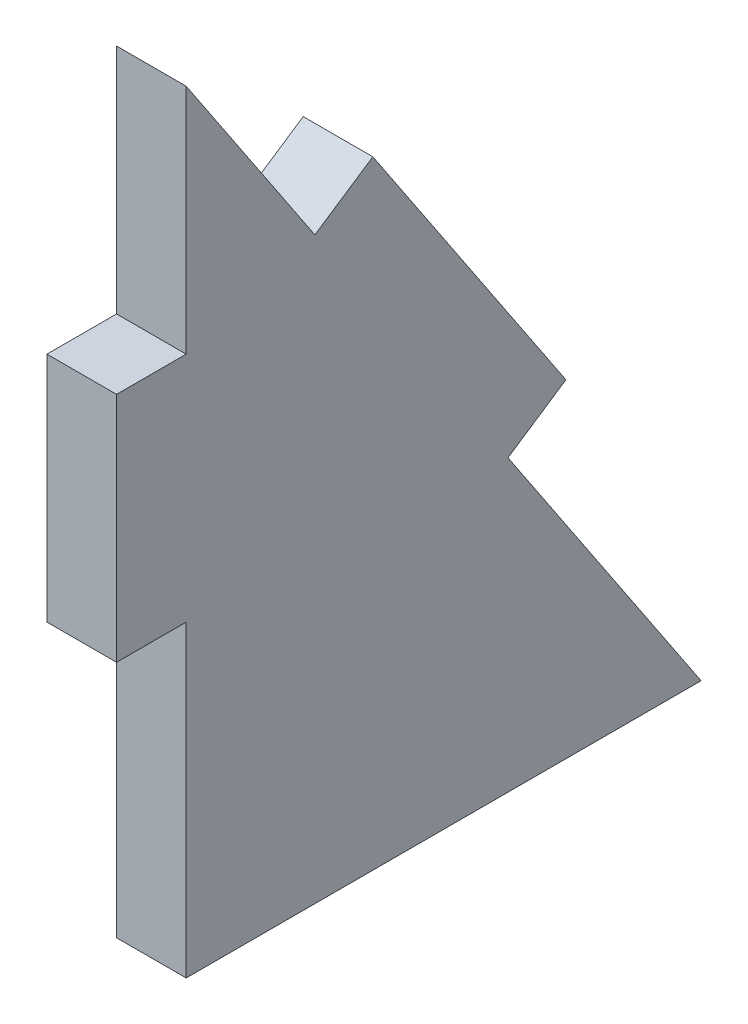
ISO-10303-21;
HEADER;
FILE_DESCRIPTION(('STEP AP214'),'2;1');
FILE_NAME('part.step','',(''),(''),'','','');
FILE_SCHEMA(('AUTOMOTIVE_DESIGN { 1 0 10303 214 1 1 1 1 }'));
ENDSEC;
DATA;
#1=APPLICATION_CONTEXT('core data for automotive mechanical design processes');
#2=APPLICATION_PROTOCOL_DEFINITION('international standard','automotive_design',2000,#1);
#3=PRODUCT_CONTEXT('',#1,'mechanical');
#4=PRODUCT('Part','Part','',(#3));
#5=PRODUCT_RELATED_PRODUCT_CATEGORY('part','',(#4));
#6=PRODUCT_DEFINITION_FORMATION('','',#4);
#7=PRODUCT_DEFINITION_CONTEXT('part definition',#1,'design');
#8=PRODUCT_DEFINITION('design','',#6,#7);
#9=PRODUCT_DEFINITION_SHAPE('','',#8);
#10=(LENGTH_UNIT() NAMED_UNIT(*) SI_UNIT(.MILLI.,.METRE.));
#11=(NAMED_UNIT(*) PLANE_ANGLE_UNIT() SI_UNIT($,.RADIAN.));
#12=(NAMED_UNIT(*) SI_UNIT($,.STERADIAN.) SOLID_ANGLE_UNIT());
#13=UNCERTAINTY_MEASURE_WITH_UNIT(LENGTH_MEASURE(1.E-05),#10,'distance_accuracy_value','');
#14=(GEOMETRIC_REPRESENTATION_CONTEXT(3) GLOBAL_UNCERTAINTY_ASSIGNED_CONTEXT((#13)) GLOBAL_UNIT_ASSIGNED_CONTEXT((#10,
#11,#12)) REPRESENTATION_CONTEXT('',''));
#15=CARTESIAN_POINT('',(0.,0.,0.));
#16=DIRECTION('',(0.,0.,1.));
#17=DIRECTION('',(1.,0.,0.));
#18=AXIS2_PLACEMENT_3D('',#15,#16,#17);
#19=CARTESIAN_POINT('',(3.,0.,0.));
#20=DIRECTION('',(0.,0.,-1.));
#21=DIRECTION('',(-1.,0.,0.));
#22=AXIS2_PLACEMENT_3D('',#19,#20,#21);
#23=PLANE('',#22);
#24=DIRECTION('',(0.,-1.,0.));
#25=VECTOR('',#24,1.);
#26=CARTESIAN_POINT('',(0.,0.,0.));
#27=LINE('',#26,#25);
#28=CARTESIAN_POINT('',(0.,13.282011771957,0.));
#29=VERTEX_POINT('',#28);
#30=CARTESIAN_POINT('',(0.,0.,0.));
#31=VERTEX_POINT('',#30);
#32=EDGE_CURVE('E148',#29,#31,#27,.T.);
#33=ORIENTED_EDGE('',*,*,#32,.T.);
#34=DIRECTION('',(-1.,0.,0.));
#35=VECTOR('',#34,1.);
#36=CARTESIAN_POINT('',(3.,0.,0.));
#37=LINE('',#36,#35);
#38=CARTESIAN_POINT('',(3.,0.,0.));
#39=VERTEX_POINT('',#38);
#40=EDGE_CURVE('E11',#39,#31,#37,.T.);
#41=ORIENTED_EDGE('',*,*,#40,.F.);
#42=DIRECTION('',(0.,-1.,0.));
#43=VECTOR('',#42,1.);
#44=CARTESIAN_POINT('',(3.,0.,0.));
#45=LINE('',#44,#43);
#46=CARTESIAN_POINT('',(3.,13.282011771957,0.));
#47=VERTEX_POINT('',#46);
#48=EDGE_CURVE('E168',#47,#39,#45,.T.);
#49=ORIENTED_EDGE('',*,*,#48,.F.);
#50=DIRECTION('',(-1.,0.,0.));
#51=VECTOR('',#50,1.);
#52=CARTESIAN_POINT('',(3.,13.282011771957,0.));
#53=LINE('',#52,#51);
#54=EDGE_CURVE('E144',#47,#29,#53,.T.);
#55=ORIENTED_EDGE('',*,*,#54,.T.);
#56=EDGE_LOOP('',(#33,#41,#49,#55));
#57=FACE_BOUND('',#56,.T.);
#58=ADVANCED_FACE('F34',(#57),#23,.F.);
#59=CARTESIAN_POINT('',(3.,0.,0.));
#60=DIRECTION('',(0.,1.,0.));
#61=DIRECTION('',(0.,0.,1.));
#62=AXIS2_PLACEMENT_3D('',#59,#60,#61);
#63=PLANE('',#62);
#64=DIRECTION('',(0.,0.,-1.));
#65=VECTOR('',#64,1.);
#66=CARTESIAN_POINT('',(0.,0.,0.));
#67=LINE('',#66,#65);
#68=CARTESIAN_POINT('',(0.,0.,-22.1880078513443));
#69=VERTEX_POINT('',#68);
#70=EDGE_CURVE('E151',#31,#69,#67,.T.);
#71=ORIENTED_EDGE('',*,*,#70,.T.);
#72=DIRECTION('',(-1.,0.,0.));
#73=VECTOR('',#72,1.);
#74=CARTESIAN_POINT('',(3.,0.,-22.1880078513443));
#75=LINE('',#74,#73);
#76=CARTESIAN_POINT('',(3.,0.,-22.1880078513443));
#77=VERTEX_POINT('',#76);
#78=EDGE_CURVE('E42',#77,#69,#75,.T.);
#79=ORIENTED_EDGE('',*,*,#78,.F.);
#80=DIRECTION('',(0.,0.,-1.));
#81=VECTOR('',#80,1.);
#82=CARTESIAN_POINT('',(3.,0.,0.));
#83=LINE('',#82,#81);
#84=EDGE_CURVE('E102',#39,#77,#83,.T.);
#85=ORIENTED_EDGE('',*,*,#84,.F.);
#86=ORIENTED_EDGE('',*,*,#40,.T.);
#87=EDGE_LOOP('',(#71,#79,#85,#86));
#88=FACE_BOUND('',#87,.T.);
#89=ADVANCED_FACE('F240',(#88),#63,.F.);
#90=CARTESIAN_POINT('',(3.,12.4807544144839,-13.8675049070903));
#91=DIRECTION('',(0.,-0.554700196283604,0.832050294298927));
#92=DIRECTION('',(0.,-0.832050294298928,-0.554700196283604));
#93=AXIS2_PLACEMENT_3D('',#90,#91,#92);
#94=PLANE('',#93);
#95=DIRECTION('',(0.,0.832050294298927,0.554700196283604));
#96=VECTOR('',#95,1.);
#97=CARTESIAN_POINT('',(0.,12.4807544144839,-13.8675049070903));
#98=LINE('',#97,#96);
#99=CARTESIAN_POINT('',(0.,12.4807544144839,-13.8675049070903));
#100=VERTEX_POINT('',#99);
#101=EDGE_CURVE('E153',#69,#100,#98,.T.);
#102=ORIENTED_EDGE('',*,*,#101,.T.);
#103=DIRECTION('',(-1.,0.,0.));
#104=VECTOR('',#103,1.);
#105=CARTESIAN_POINT('',(3.,12.4807544144839,-13.8675049070903));
#106=LINE('',#105,#104);
#107=CARTESIAN_POINT('',(3.,12.4807544144839,-13.8675049070903));
#108=VERTEX_POINT('',#107);
#109=EDGE_CURVE('E184',#108,#100,#106,.T.);
#110=ORIENTED_EDGE('',*,*,#109,.F.);
#111=DIRECTION('',(0.,0.832050294298927,0.554700196283604));
#112=VECTOR('',#111,1.);
#113=CARTESIAN_POINT('',(3.,12.4807544144839,-13.8675049070903));
#114=LINE('',#113,#112);
#115=EDGE_CURVE('E192',#77,#108,#114,.T.);
#116=ORIENTED_EDGE('',*,*,#115,.F.);
#117=ORIENTED_EDGE('',*,*,#78,.T.);
#118=EDGE_LOOP('',(#102,#110,#116,#117));
#119=FACE_BOUND('',#118,.T.);
#120=ADVANCED_FACE('F190',(#119),#94,.F.);
#121=CARTESIAN_POINT('',(3.,12.4807544144839,-13.8675049070903));
#122=DIRECTION('',(0.,0.832050294298922,0.554700196283612));
#123=DIRECTION('',(0.,-0.554700196283612,0.832050294298922));
#124=AXIS2_PLACEMENT_3D('',#121,#122,#123);
#125=PLANE('',#124);
#126=DIRECTION('',(0.,0.554700196283612,-0.832050294298922));
#127=VECTOR('',#126,1.);
#128=CARTESIAN_POINT('',(0.,12.4807544144839,-13.8675049070903));
#129=LINE('',#128,#127);
#130=CARTESIAN_POINT('',(0.,14.1448550033347,-16.363655789987));
#131=VERTEX_POINT('',#130);
#132=EDGE_CURVE('E155',#100,#131,#129,.T.);
#133=ORIENTED_EDGE('',*,*,#132,.T.);
#134=DIRECTION('',(-1.,0.,0.));
#135=VECTOR('',#134,1.);
#136=CARTESIAN_POINT('',(3.,14.1448550033347,-16.363655789987));
#137=LINE('',#136,#135);
#138=CARTESIAN_POINT('',(3.,14.1448550033347,-16.363655789987));
#139=VERTEX_POINT('',#138);
#140=EDGE_CURVE('E181',#139,#131,#137,.T.);
#141=ORIENTED_EDGE('',*,*,#140,.F.);
#142=DIRECTION('',(0.,0.554700196283612,-0.832050294298922));
#143=VECTOR('',#142,1.);
#144=CARTESIAN_POINT('',(3.,12.4807544144839,-13.8675049070903));
#145=LINE('',#144,#143);
#146=EDGE_CURVE('E210',#108,#139,#145,.T.);
#147=ORIENTED_EDGE('',*,*,#146,.F.);
#148=ORIENTED_EDGE('',*,*,#109,.T.);
#149=EDGE_LOOP('',(#133,#141,#147,#148));
#150=FACE_BOUND('',#149,.T.);
#151=ADVANCED_FACE('F201',(#150),#125,.F.);
#152=CARTESIAN_POINT('',(3.,26.6256094178186,-8.0431528457329));
#153=DIRECTION('',(0.,-0.554700196283608,0.832050294298924));
#154=DIRECTION('',(0.,-0.832050294298925,-0.554700196283608));
#155=AXIS2_PLACEMENT_3D('',#152,#153,#154);
#156=PLANE('',#155);
#157=DIRECTION('',(0.,0.832050294298925,0.554700196283608));
#158=VECTOR('',#157,1.);
#159=CARTESIAN_POINT('',(0.,26.6256094178186,-8.0431528457329));
#160=LINE('',#159,#158);
#161=CARTESIAN_POINT('',(0.,26.6256094178186,-8.0431528457329));
#162=VERTEX_POINT('',#161);
#163=EDGE_CURVE('E157',#131,#162,#160,.T.);
#164=ORIENTED_EDGE('',*,*,#163,.T.);
#165=DIRECTION('',(-1.,0.,0.));
#166=VECTOR('',#165,1.);
#167=CARTESIAN_POINT('',(3.,26.6256094178186,-8.0431528457329));
#168=LINE('',#167,#166);
#169=CARTESIAN_POINT('',(3.,26.6256094178186,-8.0431528457329));
#170=VERTEX_POINT('',#169);
#171=EDGE_CURVE('E178',#170,#162,#168,.T.);
#172=ORIENTED_EDGE('',*,*,#171,.F.);
#173=DIRECTION('',(0.,0.832050294298925,0.554700196283608));
#174=VECTOR('',#173,1.);
#175=CARTESIAN_POINT('',(3.,26.6256094178186,-8.0431528457329));
#176=LINE('',#175,#174);
#177=EDGE_CURVE('E207',#139,#170,#176,.T.);
#178=ORIENTED_EDGE('',*,*,#177,.F.);
#179=ORIENTED_EDGE('',*,*,#140,.T.);
#180=EDGE_LOOP('',(#164,#172,#178,#179));
#181=FACE_BOUND('',#180,.T.);
#182=ADVANCED_FACE('F205',(#181),#156,.F.);
#183=CARTESIAN_POINT('',(3.,24.9615088289677,-5.54700196283607));
#184=DIRECTION('',(0.,-0.832050294298923,-0.55470019628361));
#185=DIRECTION('',(0.,0.55470019628361,-0.832050294298923));
#186=AXIS2_PLACEMENT_3D('',#183,#184,#185);
#187=PLANE('',#186);
#188=DIRECTION('',(0.,-0.55470019628361,0.832050294298923));
#189=VECTOR('',#188,1.);
#190=CARTESIAN_POINT('',(0.,24.9615088289677,-5.54700196283607));
#191=LINE('',#190,#189);
#192=CARTESIAN_POINT('',(0.,24.9615088289677,-5.54700196283607));
#193=VERTEX_POINT('',#192);
#194=EDGE_CURVE('E159',#162,#193,#191,.T.);
#195=ORIENTED_EDGE('',*,*,#194,.T.);
#196=DIRECTION('',(-1.,0.,0.));
#197=VECTOR('',#196,1.);
#198=CARTESIAN_POINT('',(3.,24.9615088289677,-5.54700196283607));
#199=LINE('',#198,#197);
#200=CARTESIAN_POINT('',(3.,24.9615088289677,-5.54700196283607));
#201=VERTEX_POINT('',#200);
#202=EDGE_CURVE('E175',#201,#193,#199,.T.);
#203=ORIENTED_EDGE('',*,*,#202,.F.);
#204=DIRECTION('',(0.,-0.55470019628361,0.832050294298923));
#205=VECTOR('',#204,1.);
#206=CARTESIAN_POINT('',(3.,24.9615088289677,-5.54700196283607));
#207=LINE('',#206,#205);
#208=EDGE_CURVE('E209',#170,#201,#207,.T.);
#209=ORIENTED_EDGE('',*,*,#208,.F.);
#210=ORIENTED_EDGE('',*,*,#171,.T.);
#211=EDGE_LOOP('',(#195,#203,#209,#210));
#212=FACE_BOUND('',#211,.T.);
#213=ADVANCED_FACE('F253',(#212),#187,.F.);
#214=CARTESIAN_POINT('',(3.,33.282011771957,0.));
#215=DIRECTION('',(0.,-0.554700196283608,0.832050294298925));
#216=DIRECTION('',(0.,-0.832050294298925,-0.554700196283608));
#217=AXIS2_PLACEMENT_3D('',#214,#215,#216);
#218=PLANE('',#217);
#219=DIRECTION('',(0.,0.832050294298925,0.554700196283608));
#220=VECTOR('',#219,1.);
#221=CARTESIAN_POINT('',(0.,33.282011771957,0.));
#222=LINE('',#221,#220);
#223=CARTESIAN_POINT('',(0.,33.282011771957,0.));
#224=VERTEX_POINT('',#223);
#225=EDGE_CURVE('E161',#193,#224,#222,.T.);
#226=ORIENTED_EDGE('',*,*,#225,.T.);
#227=DIRECTION('',(-1.,0.,0.));
#228=VECTOR('',#227,1.);
#229=CARTESIAN_POINT('',(3.,33.282011771957,0.));
#230=LINE('',#229,#228);
#231=CARTESIAN_POINT('',(3.,33.282011771957,0.));
#232=VERTEX_POINT('',#231);
#233=EDGE_CURVE('E172',#232,#224,#230,.T.);
#234=ORIENTED_EDGE('',*,*,#233,.F.);
#235=DIRECTION('',(0.,0.832050294298925,0.554700196283608));
#236=VECTOR('',#235,1.);
#237=CARTESIAN_POINT('',(3.,33.282011771957,0.));
#238=LINE('',#237,#236);
#239=EDGE_CURVE('E212',#201,#232,#238,.T.);
#240=ORIENTED_EDGE('',*,*,#239,.F.);
#241=ORIENTED_EDGE('',*,*,#202,.T.);
#242=EDGE_LOOP('',(#226,#234,#240,#241));
#243=FACE_BOUND('',#242,.T.);
#244=ADVANCED_FACE('F221',(#243),#218,.F.);
#245=CARTESIAN_POINT('',(3.,23.282011771957,0.));
#246=DIRECTION('',(0.,0.,-1.));
#247=DIRECTION('',(0.,1.,0.));
#248=AXIS2_PLACEMENT_3D('',#245,#246,#247);
#249=PLANE('',#248);
#250=DIRECTION('',(0.,-1.,0.));
#251=VECTOR('',#250,1.);
#252=CARTESIAN_POINT('',(0.,23.282011771957,0.));
#253=LINE('',#252,#251);
#254=CARTESIAN_POINT('',(0.,23.282011771957,0.));
#255=VERTEX_POINT('',#254);
#256=EDGE_CURVE('E163',#224,#255,#253,.T.);
#257=ORIENTED_EDGE('',*,*,#256,.T.);
#258=DIRECTION('',(-1.,0.,0.));
#259=VECTOR('',#258,1.);
#260=CARTESIAN_POINT('',(3.,23.282011771957,0.));
#261=LINE('',#260,#259);
#262=CARTESIAN_POINT('',(3.,23.282011771957,0.));
#263=VERTEX_POINT('',#262);
#264=EDGE_CURVE('E139',#263,#255,#261,.T.);
#265=ORIENTED_EDGE('',*,*,#264,.F.);
#266=DIRECTION('',(0.,-1.,0.));
#267=VECTOR('',#266,1.);
#268=CARTESIAN_POINT('',(3.,23.282011771957,0.));
#269=LINE('',#268,#267);
#270=EDGE_CURVE('E130',#232,#263,#269,.T.);
#271=ORIENTED_EDGE('',*,*,#270,.F.);
#272=ORIENTED_EDGE('',*,*,#233,.T.);
#273=EDGE_LOOP('',(#257,#265,#271,#272));
#274=FACE_BOUND('',#273,.T.);
#275=ADVANCED_FACE('F225',(#274),#249,.F.);
#276=CARTESIAN_POINT('',(3.,23.282011771957,0.));
#277=DIRECTION('',(0.,-1.,0.));
#278=DIRECTION('',(0.,0.,-1.));
#279=AXIS2_PLACEMENT_3D('',#276,#277,#278);
#280=PLANE('',#279);
#281=DIRECTION('',(0.,0.,1.));
#282=VECTOR('',#281,1.);
#283=CARTESIAN_POINT('',(0.,23.282011771957,0.));
#284=LINE('',#283,#282);
#285=CARTESIAN_POINT('',(0.,23.282011771957,3.));
#286=VERTEX_POINT('',#285);
#287=EDGE_CURVE('E138',#255,#286,#284,.T.);
#288=ORIENTED_EDGE('',*,*,#287,.T.);
#289=DIRECTION('',(-1.,0.,0.));
#290=VECTOR('',#289,1.);
#291=CARTESIAN_POINT('',(3.,23.282011771957,3.));
#292=LINE('',#291,#290);
#293=CARTESIAN_POINT('',(3.,23.282011771957,3.));
#294=VERTEX_POINT('',#293);
#295=EDGE_CURVE('E135',#294,#286,#292,.T.);
#296=ORIENTED_EDGE('',*,*,#295,.F.);
#297=DIRECTION('',(0.,0.,1.));
#298=VECTOR('',#297,1.);
#299=CARTESIAN_POINT('',(3.,23.282011771957,0.));
#300=LINE('',#299,#298);
#301=EDGE_CURVE('E124',#263,#294,#300,.T.);
#302=ORIENTED_EDGE('',*,*,#301,.F.);
#303=ORIENTED_EDGE('',*,*,#264,.T.);
#304=EDGE_LOOP('',(#288,#296,#302,#303));
#305=FACE_BOUND('',#304,.T.);
#306=ADVANCED_FACE('F136',(#305),#280,.F.);
#307=CARTESIAN_POINT('',(3.,23.282011771957,3.));
#308=DIRECTION('',(0.,0.,-1.));
#309=DIRECTION('',(0.,1.,0.));
#310=AXIS2_PLACEMENT_3D('',#307,#308,#309);
#311=PLANE('',#310);
#312=DIRECTION('',(0.,-1.,0.));
#313=VECTOR('',#312,1.);
#314=CARTESIAN_POINT('',(0.,23.282011771957,3.));
#315=LINE('',#314,#313);
#316=CARTESIAN_POINT('',(0.,13.282011771957,3.));
#317=VERTEX_POINT('',#316);
#318=EDGE_CURVE('E88',#286,#317,#315,.T.);
#319=ORIENTED_EDGE('',*,*,#318,.T.);
#320=DIRECTION('',(-1.,0.,0.));
#321=VECTOR('',#320,1.);
#322=CARTESIAN_POINT('',(3.,13.282011771957,3.));
#323=LINE('',#322,#321);
#324=CARTESIAN_POINT('',(3.,13.282011771957,3.));
#325=VERTEX_POINT('',#324);
#326=EDGE_CURVE('E140',#325,#317,#323,.T.);
#327=ORIENTED_EDGE('',*,*,#326,.F.);
#328=DIRECTION('',(0.,-1.,0.));
#329=VECTOR('',#328,1.);
#330=CARTESIAN_POINT('',(3.,23.282011771957,3.));
#331=LINE('',#330,#329);
#332=EDGE_CURVE('E128',#294,#325,#331,.T.);
#333=ORIENTED_EDGE('',*,*,#332,.F.);
#334=ORIENTED_EDGE('',*,*,#295,.T.);
#335=EDGE_LOOP('',(#319,#327,#333,#334));
#336=FACE_BOUND('',#335,.T.);
#337=ADVANCED_FACE('F142',(#336),#311,.F.);
#338=CARTESIAN_POINT('',(3.,13.282011771957,0.));
#339=DIRECTION('',(0.,1.,0.));
#340=DIRECTION('',(0.,0.,1.));
#341=AXIS2_PLACEMENT_3D('',#338,#339,#340);
#342=PLANE('',#341);
#343=DIRECTION('',(0.,0.,-1.));
#344=VECTOR('',#343,1.);
#345=CARTESIAN_POINT('',(0.,13.282011771957,0.));
#346=LINE('',#345,#344);
#347=EDGE_CURVE('E94',#317,#29,#346,.T.);
#348=ORIENTED_EDGE('',*,*,#347,.T.);
#349=ORIENTED_EDGE('',*,*,#54,.F.);
#350=DIRECTION('',(0.,0.,-1.));
#351=VECTOR('',#350,1.);
#352=CARTESIAN_POINT('',(3.,13.282011771957,0.));
#353=LINE('',#352,#351);
#354=EDGE_CURVE('E50',#325,#47,#353,.T.);
#355=ORIENTED_EDGE('',*,*,#354,.F.);
#356=ORIENTED_EDGE('',*,*,#326,.T.);
#357=EDGE_LOOP('',(#348,#349,#355,#356));
#358=FACE_BOUND('',#357,.T.);
#359=ADVANCED_FACE('F229',(#358),#342,.F.);
#360=CARTESIAN_POINT('',(3.,0.,0.));
#361=DIRECTION('',(1.,0.,0.));
#362=DIRECTION('',(0.,0.,-1.));
#363=AXIS2_PLACEMENT_3D('',#360,#361,#362);
#364=PLANE('',#363);
#365=ORIENTED_EDGE('',*,*,#48,.T.);
#366=ORIENTED_EDGE('',*,*,#84,.T.);
#367=ORIENTED_EDGE('',*,*,#115,.T.);
#368=ORIENTED_EDGE('',*,*,#146,.T.);
#369=ORIENTED_EDGE('',*,*,#177,.T.);
#370=ORIENTED_EDGE('',*,*,#208,.T.);
#371=ORIENTED_EDGE('',*,*,#239,.T.);
#372=ORIENTED_EDGE('',*,*,#270,.T.);
#373=ORIENTED_EDGE('',*,*,#301,.T.);
#374=ORIENTED_EDGE('',*,*,#332,.T.);
#375=ORIENTED_EDGE('',*,*,#354,.T.);
#376=EDGE_LOOP('',(#365,#366,#367,#368,#369,#370,#371,#372,#373,#374,#375));
#377=FACE_BOUND('',#376,.T.);
#378=ADVANCED_FACE('F126',(#377),#364,.T.);
#379=CARTESIAN_POINT('',(0.,0.,0.));
#380=DIRECTION('',(1.,0.,0.));
#381=DIRECTION('',(0.,0.,-1.));
#382=AXIS2_PLACEMENT_3D('',#379,#380,#381);
#383=PLANE('',#382);
#384=ORIENTED_EDGE('',*,*,#32,.F.);
#385=ORIENTED_EDGE('',*,*,#347,.F.);
#386=ORIENTED_EDGE('',*,*,#318,.F.);
#387=ORIENTED_EDGE('',*,*,#287,.F.);
#388=ORIENTED_EDGE('',*,*,#256,.F.);
#389=ORIENTED_EDGE('',*,*,#225,.F.);
#390=ORIENTED_EDGE('',*,*,#194,.F.);
#391=ORIENTED_EDGE('',*,*,#163,.F.);
#392=ORIENTED_EDGE('',*,*,#132,.F.);
#393=ORIENTED_EDGE('',*,*,#101,.F.);
#394=ORIENTED_EDGE('',*,*,#70,.F.);
#395=EDGE_LOOP('',(#384,#385,#386,#387,#388,#389,#390,#391,#392,#393,#394));
#396=FACE_BOUND('',#395,.T.);
#397=ADVANCED_FACE('F196',(#396),#383,.F.);
#398=CLOSED_SHELL('',(#58,#89,#120,#151,#182,#213,#244,#275,#306,#337,#359,#378,#397));
#399=MANIFOLD_SOLID_BREP('B2',#398);
#400=ADVANCED_BREP_SHAPE_REPRESENTATION('',(#18,#399),#14);
#401=SHAPE_DEFINITION_REPRESENTATION(#9,#400);
ENDSEC;
END-ISO-10303-21;
